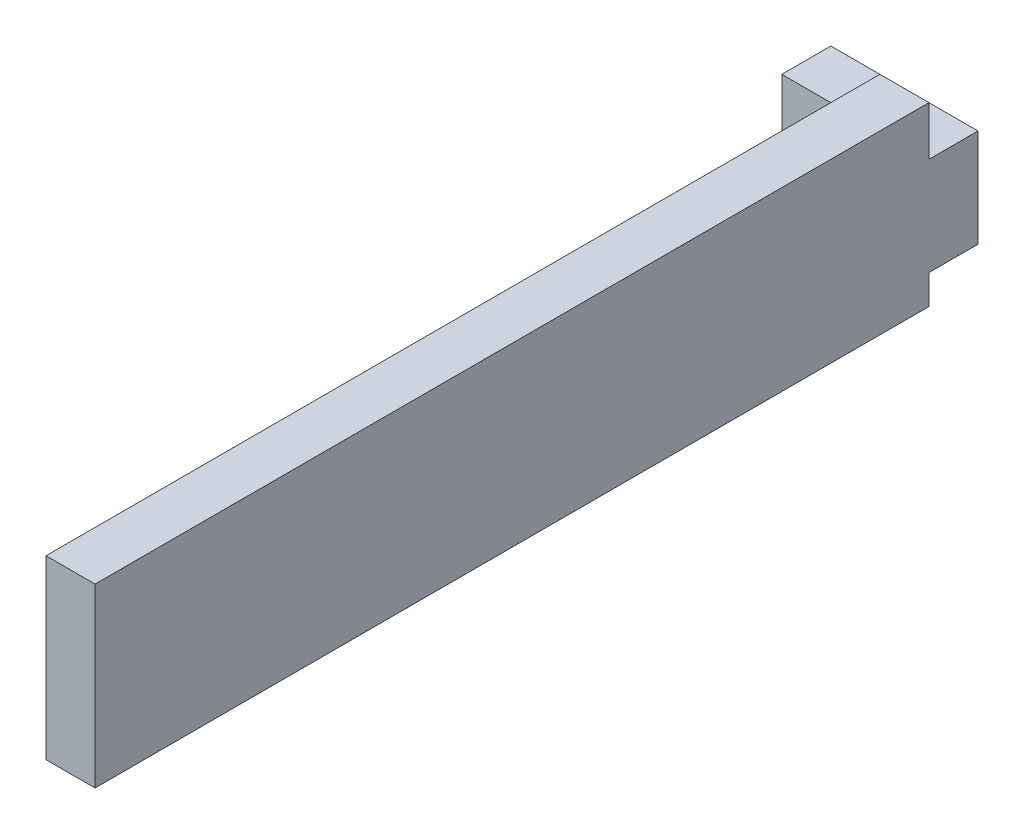
ISO-10303-21;
HEADER;
FILE_DESCRIPTION(('STEP AP214'),'2;1');
FILE_NAME('part.step','',(''),(''),'','','');
FILE_SCHEMA(('AUTOMOTIVE_DESIGN { 1 0 10303 214 1 1 1 1 }'));
ENDSEC;
DATA;
#1=APPLICATION_CONTEXT('core data for automotive mechanical design processes');
#2=APPLICATION_PROTOCOL_DEFINITION('international standard','automotive_design',2000,#1);
#3=PRODUCT_CONTEXT('',#1,'mechanical');
#4=PRODUCT('Part','Part','',(#3));
#5=PRODUCT_RELATED_PRODUCT_CATEGORY('part','',(#4));
#6=PRODUCT_DEFINITION_FORMATION('','',#4);
#7=PRODUCT_DEFINITION_CONTEXT('part definition',#1,'design');
#8=PRODUCT_DEFINITION('design','',#6,#7);
#9=PRODUCT_DEFINITION_SHAPE('','',#8);
#10=(LENGTH_UNIT() NAMED_UNIT(*) SI_UNIT(.MILLI.,.METRE.));
#11=(NAMED_UNIT(*) PLANE_ANGLE_UNIT() SI_UNIT($,.RADIAN.));
#12=(NAMED_UNIT(*) SI_UNIT($,.STERADIAN.) SOLID_ANGLE_UNIT());
#13=UNCERTAINTY_MEASURE_WITH_UNIT(LENGTH_MEASURE(1.E-05),#10,'distance_accuracy_value','');
#14=(GEOMETRIC_REPRESENTATION_CONTEXT(3) GLOBAL_UNCERTAINTY_ASSIGNED_CONTEXT((#13)) GLOBAL_UNIT_ASSIGNED_CONTEXT((#10,
#11,#12)) REPRESENTATION_CONTEXT('',''));
#15=CARTESIAN_POINT('',(0.,0.,0.));
#16=DIRECTION('',(0.,0.,1.));
#17=DIRECTION('',(1.,0.,0.));
#18=AXIS2_PLACEMENT_3D('',#15,#16,#17);
#19=CARTESIAN_POINT('',(0.,10.,0.));
#20=DIRECTION('',(0.,-1.,0.));
#21=DIRECTION('',(0.,0.,-1.));
#22=AXIS2_PLACEMENT_3D('',#19,#20,#21);
#23=PLANE('',#22);
#24=DIRECTION('',(-1.,0.,0.));
#25=VECTOR('',#24,1.);
#26=CARTESIAN_POINT('',(15.,10.,4.99999999999999));
#27=LINE('',#26,#25);
#28=CARTESIAN_POINT('',(20.,10.,4.99999999999999));
#29=VERTEX_POINT('',#28);
#30=CARTESIAN_POINT('',(15.,10.,4.99999999999999));
#31=VERTEX_POINT('',#30);
#32=EDGE_CURVE('E49',#29,#31,#27,.T.);
#33=ORIENTED_EDGE('',*,*,#32,.F.);
#34=DIRECTION('',(0.,0.,-1.));
#35=VECTOR('',#34,1.);
#36=CARTESIAN_POINT('',(20.,10.,0.));
#37=LINE('',#36,#35);
#38=CARTESIAN_POINT('',(20.,10.,0.));
#39=VERTEX_POINT('',#38);
#40=EDGE_CURVE('E54',#29,#39,#37,.T.);
#41=ORIENTED_EDGE('',*,*,#40,.T.);
#42=DIRECTION('',(-1.,0.,0.));
#43=VECTOR('',#42,1.);
#44=CARTESIAN_POINT('',(10.,10.,0.));
#45=LINE('',#44,#43);
#46=CARTESIAN_POINT('',(5.00000000000001,10.,0.));
#47=VERTEX_POINT('',#46);
#48=EDGE_CURVE('E159',#39,#47,#45,.T.);
#49=ORIENTED_EDGE('',*,*,#48,.T.);
#50=DIRECTION('',(0.,0.,1.));
#51=VECTOR('',#50,1.);
#52=CARTESIAN_POINT('',(5.00000000000001,10.,4.99999999999999));
#53=LINE('',#52,#51);
#54=CARTESIAN_POINT('',(5.00000000000001,10.,4.99999999999999));
#55=VERTEX_POINT('',#54);
#56=EDGE_CURVE('E81',#47,#55,#53,.T.);
#57=ORIENTED_EDGE('',*,*,#56,.T.);
#58=DIRECTION('',(1.,0.,0.));
#59=VECTOR('',#58,1.);
#60=CARTESIAN_POINT('',(5.00000000000001,10.,4.99999999999999));
#61=LINE('',#60,#59);
#62=EDGE_CURVE('E163',#55,#31,#61,.T.);
#63=ORIENTED_EDGE('',*,*,#62,.T.);
#64=EDGE_LOOP('',(#33,#41,#49,#57,#63));
#65=FACE_BOUND('',#64,.T.);
#66=ADVANCED_FACE('F34',(#65),#23,.F.);
#67=CARTESIAN_POINT('',(5.00000000000001,10.,4.99999999999999));
#68=DIRECTION('',(1.,0.,0.));
#69=DIRECTION('',(0.,0.,-1.));
#70=AXIS2_PLACEMENT_3D('',#67,#68,#69);
#71=PLANE('',#70);
#72=DIRECTION('',(0.,0.,1.));
#73=VECTOR('',#72,1.);
#74=CARTESIAN_POINT('',(5.00000000000001,0.,4.99999999999999));
#75=LINE('',#74,#73);
#76=CARTESIAN_POINT('',(5.00000000000001,0.,0.));
#77=VERTEX_POINT('',#76);
#78=CARTESIAN_POINT('',(5.00000000000001,0.,4.99999999999999));
#79=VERTEX_POINT('',#78);
#80=EDGE_CURVE('E158',#77,#79,#75,.T.);
#81=ORIENTED_EDGE('',*,*,#80,.T.);
#82=DIRECTION('',(0.,-1.,0.));
#83=VECTOR('',#82,1.);
#84=CARTESIAN_POINT('',(5.00000000000001,10.,4.99999999999999));
#85=LINE('',#84,#83);
#86=EDGE_CURVE('E42',#55,#79,#85,.T.);
#87=ORIENTED_EDGE('',*,*,#86,.F.);
#88=ORIENTED_EDGE('',*,*,#56,.F.);
#89=DIRECTION('',(0.,-1.,0.));
#90=VECTOR('',#89,1.);
#91=CARTESIAN_POINT('',(5.00000000000001,10.,0.));
#92=LINE('',#91,#90);
#93=EDGE_CURVE('E11',#47,#77,#92,.T.);
#94=ORIENTED_EDGE('',*,*,#93,.T.);
#95=EDGE_LOOP('',(#81,#87,#88,#94));
#96=FACE_BOUND('',#95,.T.);
#97=ADVANCED_FACE('F36',(#96),#71,.F.);
#98=CARTESIAN_POINT('',(15.,10.,4.99999999999999));
#99=DIRECTION('',(0.,0.,-1.));
#100=DIRECTION('',(-1.,0.,0.));
#101=AXIS2_PLACEMENT_3D('',#98,#99,#100);
#102=PLANE('',#101);
#103=DIRECTION('',(1.,0.,0.));
#104=VECTOR('',#103,1.);
#105=CARTESIAN_POINT('',(15.,0.,4.99999999999999));
#106=LINE('',#105,#104);
#107=CARTESIAN_POINT('',(15.,0.,4.99999999999999));
#108=VERTEX_POINT('',#107);
#109=EDGE_CURVE('E169',#79,#108,#106,.T.);
#110=ORIENTED_EDGE('',*,*,#109,.T.);
#111=DIRECTION('',(0.,-1.,0.));
#112=VECTOR('',#111,1.);
#113=CARTESIAN_POINT('',(15.,10.,4.99999999999999));
#114=LINE('',#113,#112);
#115=EDGE_CURVE('E137',#31,#108,#114,.T.);
#116=ORIENTED_EDGE('',*,*,#115,.F.);
#117=ORIENTED_EDGE('',*,*,#62,.F.);
#118=ORIENTED_EDGE('',*,*,#86,.T.);
#119=EDGE_LOOP('',(#110,#116,#117,#118));
#120=FACE_BOUND('',#119,.T.);
#121=ADVANCED_FACE('F182',(#120),#102,.F.);
#122=CARTESIAN_POINT('',(15.,10.,90.));
#123=DIRECTION('',(1.,0.,0.));
#124=DIRECTION('',(0.,0.,-1.));
#125=AXIS2_PLACEMENT_3D('',#122,#123,#124);
#126=PLANE('',#125);
#127=ORIENTED_EDGE('',*,*,#115,.T.);
#128=DIRECTION('',(0.,1.,0.));
#129=VECTOR('',#128,1.);
#130=CARTESIAN_POINT('',(15.,-3.,4.99999999999999));
#131=LINE('',#130,#129);
#132=CARTESIAN_POINT('',(15.,-3.,4.99999999999999));
#133=VERTEX_POINT('',#132);
#134=EDGE_CURVE('E118',#133,#108,#131,.T.);
#135=ORIENTED_EDGE('',*,*,#134,.F.);
#136=DIRECTION('',(0.,0.,-1.));
#137=VECTOR('',#136,1.);
#138=CARTESIAN_POINT('',(15.,-3.,4.99999999999999));
#139=LINE('',#138,#137);
#140=CARTESIAN_POINT('',(15.,-3.,90.));
#141=VERTEX_POINT('',#140);
#142=EDGE_CURVE('E124',#141,#133,#139,.T.);
#143=ORIENTED_EDGE('',*,*,#142,.F.);
#144=DIRECTION('',(0.,-1.,0.));
#145=VECTOR('',#144,1.);
#146=CARTESIAN_POINT('',(15.,10.,90.));
#147=LINE('',#146,#145);
#148=CARTESIAN_POINT('',(15.,15.,90.));
#149=VERTEX_POINT('',#148);
#150=EDGE_CURVE('E177',#149,#141,#147,.T.);
#151=ORIENTED_EDGE('',*,*,#150,.F.);
#152=DIRECTION('',(0.,0.,1.));
#153=VECTOR('',#152,1.);
#154=CARTESIAN_POINT('',(15.,15.,4.99999999999999));
#155=LINE('',#154,#153);
#156=CARTESIAN_POINT('',(15.,15.,4.99999999999999));
#157=VERTEX_POINT('',#156);
#158=EDGE_CURVE('E139',#157,#149,#155,.T.);
#159=ORIENTED_EDGE('',*,*,#158,.F.);
#160=DIRECTION('',(0.,-1.,0.));
#161=VECTOR('',#160,1.);
#162=CARTESIAN_POINT('',(15.,15.,4.99999999999999));
#163=LINE('',#162,#161);
#164=EDGE_CURVE('E152',#157,#31,#163,.T.);
#165=ORIENTED_EDGE('',*,*,#164,.T.);
#166=EDGE_LOOP('',(#127,#135,#143,#151,#159,#165));
#167=FACE_BOUND('',#166,.T.);
#168=ADVANCED_FACE('F135',(#167),#126,.F.);
#169=CARTESIAN_POINT('',(20.,10.,90.));
#170=DIRECTION('',(0.,0.,-1.));
#171=DIRECTION('',(-1.,0.,0.));
#172=AXIS2_PLACEMENT_3D('',#169,#170,#171);
#173=PLANE('',#172);
#174=ORIENTED_EDGE('',*,*,#150,.T.);
#175=DIRECTION('',(-1.,0.,0.));
#176=VECTOR('',#175,1.);
#177=CARTESIAN_POINT('',(15.,-3.,90.));
#178=LINE('',#177,#176);
#179=CARTESIAN_POINT('',(20.,-3.,90.));
#180=VERTEX_POINT('',#179);
#181=EDGE_CURVE('E130',#180,#141,#178,.T.);
#182=ORIENTED_EDGE('',*,*,#181,.F.);
#183=DIRECTION('',(0.,-1.,0.));
#184=VECTOR('',#183,1.);
#185=CARTESIAN_POINT('',(20.,10.,90.));
#186=LINE('',#185,#184);
#187=CARTESIAN_POINT('',(20.,15.,90.));
#188=VERTEX_POINT('',#187);
#189=EDGE_CURVE('E175',#188,#180,#186,.T.);
#190=ORIENTED_EDGE('',*,*,#189,.F.);
#191=DIRECTION('',(1.,0.,0.));
#192=VECTOR('',#191,1.);
#193=CARTESIAN_POINT('',(15.,15.,90.));
#194=LINE('',#193,#192);
#195=EDGE_CURVE('E146',#149,#188,#194,.T.);
#196=ORIENTED_EDGE('',*,*,#195,.F.);
#197=EDGE_LOOP('',(#174,#182,#190,#196));
#198=FACE_BOUND('',#197,.T.);
#199=ADVANCED_FACE('F191',(#198),#173,.F.);
#200=CARTESIAN_POINT('',(20.,10.,0.));
#201=DIRECTION('',(-1.,0.,0.));
#202=DIRECTION('',(0.,0.,1.));
#203=AXIS2_PLACEMENT_3D('',#200,#201,#202);
#204=PLANE('',#203);
#205=ORIENTED_EDGE('',*,*,#189,.T.);
#206=DIRECTION('',(0.,0.,1.));
#207=VECTOR('',#206,1.);
#208=CARTESIAN_POINT('',(20.,-3.,4.99999999999999));
#209=LINE('',#208,#207);
#210=CARTESIAN_POINT('',(20.,-3.,4.99999999999999));
#211=VERTEX_POINT('',#210);
#212=EDGE_CURVE('E123',#211,#180,#209,.T.);
#213=ORIENTED_EDGE('',*,*,#212,.F.);
#214=DIRECTION('',(0.,1.,0.));
#215=VECTOR('',#214,1.);
#216=CARTESIAN_POINT('',(20.,-3.,4.99999999999999));
#217=LINE('',#216,#215);
#218=CARTESIAN_POINT('',(20.,0.,4.99999999999999));
#219=VERTEX_POINT('',#218);
#220=EDGE_CURVE('E119',#211,#219,#217,.T.);
#221=ORIENTED_EDGE('',*,*,#220,.T.);
#222=DIRECTION('',(0.,0.,-1.));
#223=VECTOR('',#222,1.);
#224=CARTESIAN_POINT('',(20.,0.,0.));
#225=LINE('',#224,#223);
#226=CARTESIAN_POINT('',(20.,0.,0.));
#227=VERTEX_POINT('',#226);
#228=EDGE_CURVE('E76',#219,#227,#225,.T.);
#229=ORIENTED_EDGE('',*,*,#228,.T.);
#230=DIRECTION('',(0.,-1.,0.));
#231=VECTOR('',#230,1.);
#232=CARTESIAN_POINT('',(20.,10.,0.));
#233=LINE('',#232,#231);
#234=EDGE_CURVE('E166',#39,#227,#233,.T.);
#235=ORIENTED_EDGE('',*,*,#234,.F.);
#236=ORIENTED_EDGE('',*,*,#40,.F.);
#237=DIRECTION('',(0.,-1.,0.));
#238=VECTOR('',#237,1.);
#239=CARTESIAN_POINT('',(20.,15.,4.99999999999999));
#240=LINE('',#239,#238);
#241=CARTESIAN_POINT('',(20.,15.,4.99999999999999));
#242=VERTEX_POINT('',#241);
#243=EDGE_CURVE('E155',#242,#29,#240,.T.);
#244=ORIENTED_EDGE('',*,*,#243,.F.);
#245=DIRECTION('',(0.,0.,-1.));
#246=VECTOR('',#245,1.);
#247=CARTESIAN_POINT('',(20.,15.,4.99999999999999));
#248=LINE('',#247,#246);
#249=EDGE_CURVE('E149',#188,#242,#248,.T.);
#250=ORIENTED_EDGE('',*,*,#249,.F.);
#251=EDGE_LOOP('',(#205,#213,#221,#229,#235,#236,#244,#250));
#252=FACE_BOUND('',#251,.T.);
#253=ADVANCED_FACE('F202',(#252),#204,.F.);
#254=CARTESIAN_POINT('',(10.,10.,0.));
#255=DIRECTION('',(0.,0.,1.));
#256=DIRECTION('',(1.,0.,0.));
#257=AXIS2_PLACEMENT_3D('',#254,#255,#256);
#258=PLANE('',#257);
#259=DIRECTION('',(-1.,0.,0.));
#260=VECTOR('',#259,1.);
#261=CARTESIAN_POINT('',(10.,0.,0.));
#262=LINE('',#261,#260);
#263=EDGE_CURVE('E161',#227,#77,#262,.T.);
#264=ORIENTED_EDGE('',*,*,#263,.T.);
#265=ORIENTED_EDGE('',*,*,#93,.F.);
#266=ORIENTED_EDGE('',*,*,#48,.F.);
#267=ORIENTED_EDGE('',*,*,#234,.T.);
#268=EDGE_LOOP('',(#264,#265,#266,#267));
#269=FACE_BOUND('',#268,.T.);
#270=ADVANCED_FACE('F204',(#269),#258,.F.);
#271=CARTESIAN_POINT('',(0.,0.,0.));
#272=DIRECTION('',(0.,-1.,0.));
#273=DIRECTION('',(0.,0.,-1.));
#274=AXIS2_PLACEMENT_3D('',#271,#272,#273);
#275=PLANE('',#274);
#276=DIRECTION('',(1.,0.,0.));
#277=VECTOR('',#276,1.);
#278=CARTESIAN_POINT('',(15.,0.,4.99999999999999));
#279=LINE('',#278,#277);
#280=EDGE_CURVE('E132',#108,#219,#279,.T.);
#281=ORIENTED_EDGE('',*,*,#280,.F.);
#282=ORIENTED_EDGE('',*,*,#109,.F.);
#283=ORIENTED_EDGE('',*,*,#80,.F.);
#284=ORIENTED_EDGE('',*,*,#263,.F.);
#285=ORIENTED_EDGE('',*,*,#228,.F.);
#286=EDGE_LOOP('',(#281,#282,#283,#284,#285));
#287=FACE_BOUND('',#286,.T.);
#288=ADVANCED_FACE('F187',(#287),#275,.T.);
#289=CARTESIAN_POINT('',(15.,15.,4.99999999999999));
#290=DIRECTION('',(0.,0.,1.));
#291=DIRECTION('',(1.,0.,0.));
#292=AXIS2_PLACEMENT_3D('',#289,#290,#291);
#293=PLANE('',#292);
#294=ORIENTED_EDGE('',*,*,#32,.T.);
#295=ORIENTED_EDGE('',*,*,#164,.F.);
#296=DIRECTION('',(-1.,0.,0.));
#297=VECTOR('',#296,1.);
#298=CARTESIAN_POINT('',(15.,15.,4.99999999999999));
#299=LINE('',#298,#297);
#300=EDGE_CURVE('E151',#242,#157,#299,.T.);
#301=ORIENTED_EDGE('',*,*,#300,.F.);
#302=ORIENTED_EDGE('',*,*,#243,.T.);
#303=EDGE_LOOP('',(#294,#295,#301,#302));
#304=FACE_BOUND('',#303,.T.);
#305=ADVANCED_FACE('F201',(#304),#293,.F.);
#306=CARTESIAN_POINT('',(0.,15.,0.));
#307=DIRECTION('',(0.,1.,0.));
#308=DIRECTION('',(0.,0.,1.));
#309=AXIS2_PLACEMENT_3D('',#306,#307,#308);
#310=PLANE('',#309);
#311=ORIENTED_EDGE('',*,*,#158,.T.);
#312=ORIENTED_EDGE('',*,*,#195,.T.);
#313=ORIENTED_EDGE('',*,*,#249,.T.);
#314=ORIENTED_EDGE('',*,*,#300,.T.);
#315=EDGE_LOOP('',(#311,#312,#313,#314));
#316=FACE_BOUND('',#315,.T.);
#317=ADVANCED_FACE('F196',(#316),#310,.T.);
#318=CARTESIAN_POINT('',(15.,-3.,4.99999999999999));
#319=DIRECTION('',(0.,0.,1.));
#320=DIRECTION('',(1.,0.,0.));
#321=AXIS2_PLACEMENT_3D('',#318,#319,#320);
#322=PLANE('',#321);
#323=ORIENTED_EDGE('',*,*,#280,.T.);
#324=ORIENTED_EDGE('',*,*,#220,.F.);
#325=DIRECTION('',(1.,0.,0.));
#326=VECTOR('',#325,1.);
#327=CARTESIAN_POINT('',(15.,-3.,4.99999999999999));
#328=LINE('',#327,#326);
#329=EDGE_CURVE('E113',#133,#211,#328,.T.);
#330=ORIENTED_EDGE('',*,*,#329,.F.);
#331=ORIENTED_EDGE('',*,*,#134,.T.);
#332=EDGE_LOOP('',(#323,#324,#330,#331));
#333=FACE_BOUND('',#332,.T.);
#334=ADVANCED_FACE('F116',(#333),#322,.F.);
#335=CARTESIAN_POINT('',(0.,-3.,0.));
#336=DIRECTION('',(0.,1.,0.));
#337=DIRECTION('',(0.,0.,1.));
#338=AXIS2_PLACEMENT_3D('',#335,#336,#337);
#339=PLANE('',#338);
#340=ORIENTED_EDGE('',*,*,#142,.T.);
#341=ORIENTED_EDGE('',*,*,#329,.T.);
#342=ORIENTED_EDGE('',*,*,#212,.T.);
#343=ORIENTED_EDGE('',*,*,#181,.T.);
#344=EDGE_LOOP('',(#340,#341,#342,#343));
#345=FACE_BOUND('',#344,.T.);
#346=ADVANCED_FACE('F128',(#345),#339,.F.);
#347=CLOSED_SHELL('',(#66,#97,#121,#168,#199,#253,#270,#288,#305,#317,#334,#346));
#348=MANIFOLD_SOLID_BREP('B2',#347);
#349=ADVANCED_BREP_SHAPE_REPRESENTATION('',(#18,#348),#14);
#350=SHAPE_DEFINITION_REPRESENTATION(#9,#349);
ENDSEC;
END-ISO-10303-21;
